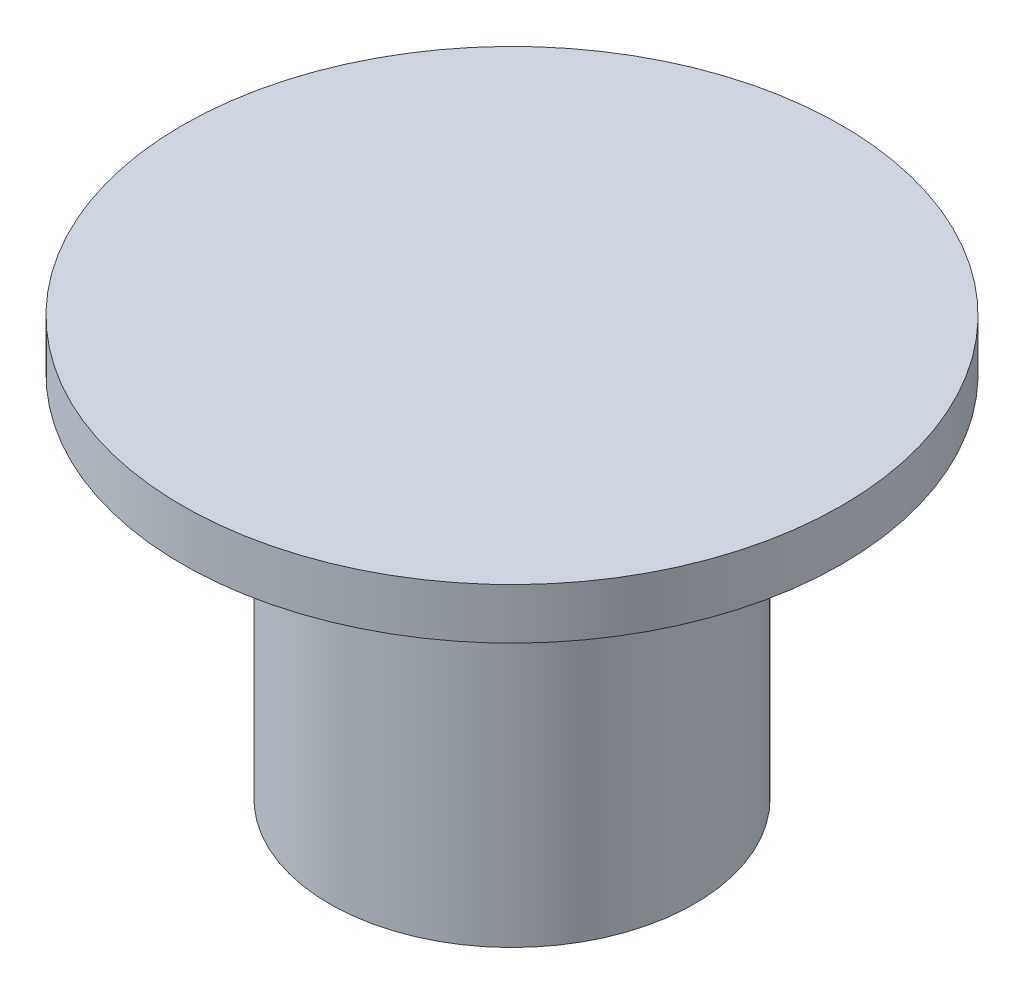
ISO-10303-21;
HEADER;
FILE_DESCRIPTION(('STEP AP214'),'2;1');
FILE_NAME('part.step','',(''),(''),'','','');
FILE_SCHEMA(('AUTOMOTIVE_DESIGN { 1 0 10303 214 1 1 1 1 }'));
ENDSEC;
DATA;
#1=APPLICATION_CONTEXT('core data for automotive mechanical design processes');
#2=APPLICATION_PROTOCOL_DEFINITION('international standard','automotive_design',2000,#1);
#3=PRODUCT_CONTEXT('',#1,'mechanical');
#4=PRODUCT('Part','Part','',(#3));
#5=PRODUCT_RELATED_PRODUCT_CATEGORY('part','',(#4));
#6=PRODUCT_DEFINITION_FORMATION('','',#4);
#7=PRODUCT_DEFINITION_CONTEXT('part definition',#1,'design');
#8=PRODUCT_DEFINITION('design','',#6,#7);
#9=PRODUCT_DEFINITION_SHAPE('','',#8);
#10=(LENGTH_UNIT() NAMED_UNIT(*) SI_UNIT(.MILLI.,.METRE.));
#11=(NAMED_UNIT(*) PLANE_ANGLE_UNIT() SI_UNIT($,.RADIAN.));
#12=(NAMED_UNIT(*) SI_UNIT($,.STERADIAN.) SOLID_ANGLE_UNIT());
#13=UNCERTAINTY_MEASURE_WITH_UNIT(LENGTH_MEASURE(1.E-05),#10,'distance_accuracy_value','');
#14=(GEOMETRIC_REPRESENTATION_CONTEXT(3) GLOBAL_UNCERTAINTY_ASSIGNED_CONTEXT((#13)) GLOBAL_UNIT_ASSIGNED_CONTEXT((#10,
#11,#12)) REPRESENTATION_CONTEXT('',''));
#15=CARTESIAN_POINT('',(0.,0.,0.));
#16=DIRECTION('',(0.,0.,1.));
#17=DIRECTION('',(1.,0.,0.));
#18=AXIS2_PLACEMENT_3D('',#15,#16,#17);
#19=CARTESIAN_POINT('',(0.,18.,0.));
#20=DIRECTION('',(0.,1.,0.));
#21=DIRECTION('',(-1.,0.,0.));
#22=AXIS2_PLACEMENT_3D('',#19,#20,#21);
#23=CYLINDRICAL_SURFACE('',#22,1.6);
#24=CARTESIAN_POINT('',(0.,1.5,0.));
#25=DIRECTION('',(0.,1.,0.));
#26=DIRECTION('',(-1.,0.,0.));
#27=AXIS2_PLACEMENT_3D('',#24,#25,#26);
#28=CIRCLE('',#27,1.6);
#29=CARTESIAN_POINT('',(-1.6,1.5,0.));
#30=VERTEX_POINT('',#29);
#31=EDGE_CURVE('E10',#30,#30,#28,.T.);
#32=ORIENTED_EDGE('',*,*,#31,.F.);
#33=EDGE_LOOP('',(#32));
#34=FACE_BOUND('',#33,.T.);
#35=CARTESIAN_POINT('',(0.,2.,0.));
#36=DIRECTION('',(0.,1.,0.));
#37=DIRECTION('',(-1.,0.,0.));
#38=AXIS2_PLACEMENT_3D('',#35,#36,#37);
#39=CIRCLE('',#38,1.6);
#40=CARTESIAN_POINT('',(-1.6,2.,0.));
#41=VERTEX_POINT('',#40);
#42=EDGE_CURVE('E59',#41,#41,#39,.T.);
#43=ORIENTED_EDGE('',*,*,#42,.T.);
#44=EDGE_LOOP('',(#43));
#45=FACE_BOUND('',#44,.T.);
#46=ADVANCED_FACE('F37',(#34,#45),#23,.F.);
#47=CARTESIAN_POINT('',(0.,1.5,0.));
#48=DIRECTION('',(0.,1.,0.));
#49=DIRECTION('',(-1.,0.,0.));
#50=AXIS2_PLACEMENT_3D('',#47,#48,#49);
#51=PLANE('',#50);
#52=CARTESIAN_POINT('',(0.,1.5,0.));
#53=DIRECTION('',(0.,1.,0.));
#54=DIRECTION('',(-1.,0.,0.));
#55=AXIS2_PLACEMENT_3D('',#52,#53,#54);
#56=CIRCLE('',#55,7.2);
#57=CARTESIAN_POINT('',(-7.2,1.5,0.));
#58=VERTEX_POINT('',#57);
#59=EDGE_CURVE('E43',#58,#58,#56,.T.);
#60=ORIENTED_EDGE('',*,*,#59,.F.);
#61=EDGE_LOOP('',(#60));
#62=FACE_BOUND('',#61,.T.);
#63=ORIENTED_EDGE('',*,*,#31,.T.);
#64=EDGE_LOOP('',(#63));
#65=FACE_BOUND('',#64,.T.);
#66=ADVANCED_FACE('F75',(#62,#65),#51,.F.);
#67=CARTESIAN_POINT('',(0.,18.,0.));
#68=DIRECTION('',(0.,1.,0.));
#69=DIRECTION('',(-1.,0.,0.));
#70=AXIS2_PLACEMENT_3D('',#67,#68,#69);
#71=CYLINDRICAL_SURFACE('',#70,7.2);
#72=CARTESIAN_POINT('',(0.,16.,0.));
#73=DIRECTION('',(0.,1.,0.));
#74=DIRECTION('',(-1.,0.,0.));
#75=AXIS2_PLACEMENT_3D('',#72,#73,#74);
#76=CIRCLE('',#75,7.2);
#77=CARTESIAN_POINT('',(-7.2,16.,0.));
#78=VERTEX_POINT('',#77);
#79=EDGE_CURVE('E47',#78,#78,#76,.T.);
#80=ORIENTED_EDGE('',*,*,#79,.F.);
#81=EDGE_LOOP('',(#80));
#82=FACE_BOUND('',#81,.T.);
#83=ORIENTED_EDGE('',*,*,#59,.T.);
#84=EDGE_LOOP('',(#83));
#85=FACE_BOUND('',#84,.T.);
#86=ADVANCED_FACE('F80',(#82,#85),#71,.T.);
#87=CARTESIAN_POINT('',(0.,16.,0.));
#88=DIRECTION('',(0.,1.,0.));
#89=DIRECTION('',(-1.,0.,0.));
#90=AXIS2_PLACEMENT_3D('',#87,#88,#89);
#91=PLANE('',#90);
#92=CARTESIAN_POINT('',(0.,16.,0.));
#93=DIRECTION('',(0.,1.,0.));
#94=DIRECTION('',(-1.,0.,0.));
#95=AXIS2_PLACEMENT_3D('',#92,#93,#94);
#96=CIRCLE('',#95,13.);
#97=CARTESIAN_POINT('',(-13.,16.,0.));
#98=VERTEX_POINT('',#97);
#99=EDGE_CURVE('E51',#98,#98,#96,.T.);
#100=ORIENTED_EDGE('',*,*,#99,.F.);
#101=EDGE_LOOP('',(#100));
#102=FACE_BOUND('',#101,.T.);
#103=ORIENTED_EDGE('',*,*,#79,.T.);
#104=EDGE_LOOP('',(#103));
#105=FACE_BOUND('',#104,.T.);
#106=ADVANCED_FACE('F85',(#102,#105),#91,.F.);
#107=CARTESIAN_POINT('',(0.,18.,0.));
#108=DIRECTION('',(0.,1.,0.));
#109=DIRECTION('',(-1.,0.,0.));
#110=AXIS2_PLACEMENT_3D('',#107,#108,#109);
#111=CYLINDRICAL_SURFACE('',#110,13.);
#112=CARTESIAN_POINT('',(0.,18.,0.));
#113=DIRECTION('',(0.,1.,0.));
#114=DIRECTION('',(-1.,0.,0.));
#115=AXIS2_PLACEMENT_3D('',#112,#113,#114);
#116=CIRCLE('',#115,13.);
#117=CARTESIAN_POINT('',(-13.,18.,0.));
#118=VERTEX_POINT('',#117);
#119=EDGE_CURVE('E56',#118,#118,#116,.T.);
#120=ORIENTED_EDGE('',*,*,#119,.F.);
#121=EDGE_LOOP('',(#120));
#122=FACE_BOUND('',#121,.T.);
#123=ORIENTED_EDGE('',*,*,#99,.T.);
#124=EDGE_LOOP('',(#123));
#125=FACE_BOUND('',#124,.T.);
#126=ADVANCED_FACE('F71',(#122,#125),#111,.T.);
#127=CARTESIAN_POINT('',(0.,18.,0.));
#128=DIRECTION('',(0.,-1.,0.));
#129=DIRECTION('',(1.,0.,0.));
#130=AXIS2_PLACEMENT_3D('',#127,#128,#129);
#131=PLANE('',#130);
#132=ORIENTED_EDGE('',*,*,#119,.T.);
#133=EDGE_LOOP('',(#132));
#134=FACE_BOUND('',#133,.T.);
#135=ADVANCED_FACE('F66',(#134),#131,.F.);
#136=CARTESIAN_POINT('',(0.,2.,0.));
#137=DIRECTION('',(0.,1.,0.));
#138=DIRECTION('',(-1.,0.,0.));
#139=AXIS2_PLACEMENT_3D('',#136,#137,#138);
#140=PLANE('',#139);
#141=ORIENTED_EDGE('',*,*,#42,.F.);
#142=EDGE_LOOP('',(#141));
#143=FACE_BOUND('',#142,.T.);
#144=ADVANCED_FACE('F64',(#143),#140,.F.);
#145=CLOSED_SHELL('',(#46,#66,#86,#106,#126,#135,#144));
#146=MANIFOLD_SOLID_BREP('B2',#145);
#147=ADVANCED_BREP_SHAPE_REPRESENTATION('',(#18,#146),#14);
#148=SHAPE_DEFINITION_REPRESENTATION(#9,#147);
ENDSEC;
END-ISO-10303-21;
